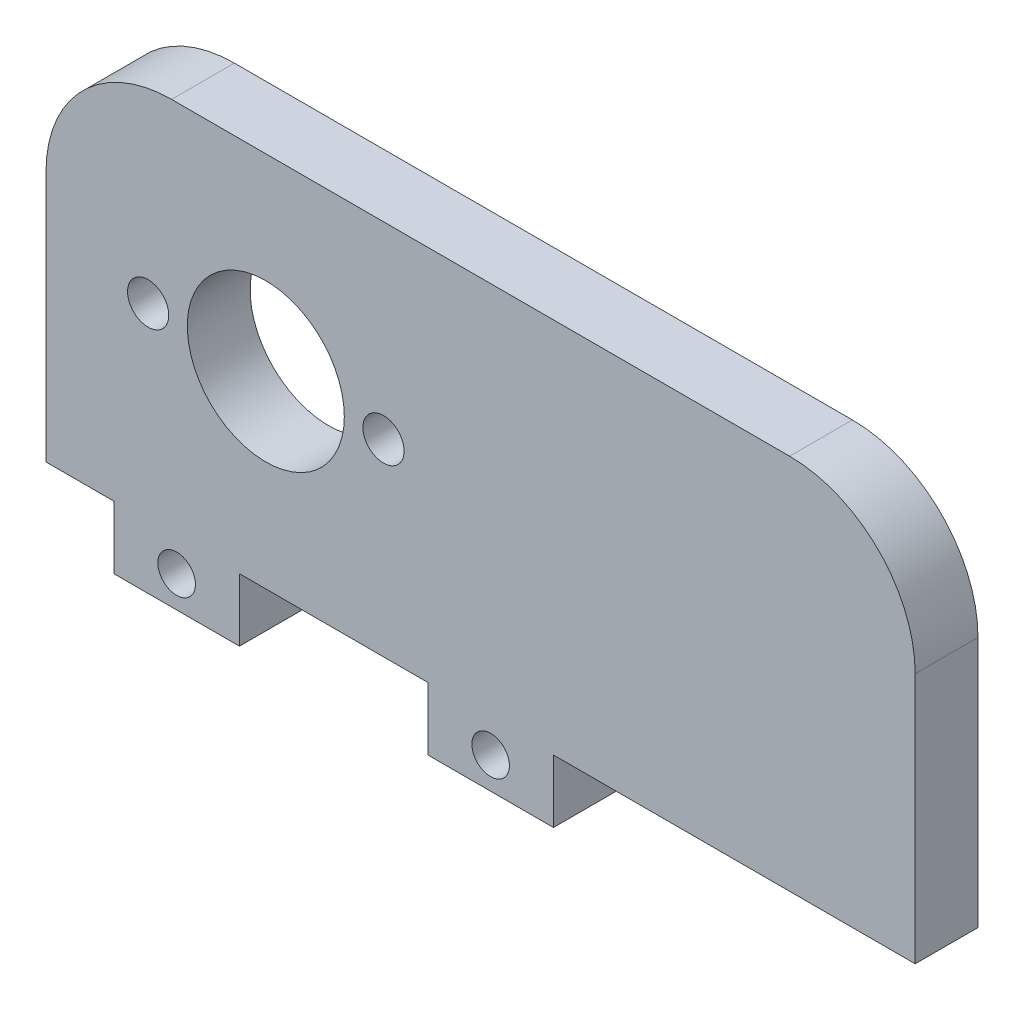
ISO-10303-21;
HEADER;
FILE_DESCRIPTION(('STEP AP214'),'2;1');
FILE_NAME('part.step','',(''),(''),'','','');
FILE_SCHEMA(('AUTOMOTIVE_DESIGN { 1 0 10303 214 1 1 1 1 }'));
ENDSEC;
DATA;
#1=APPLICATION_CONTEXT('core data for automotive mechanical design processes');
#2=APPLICATION_PROTOCOL_DEFINITION('international standard','automotive_design',2000,#1);
#3=PRODUCT_CONTEXT('',#1,'mechanical');
#4=PRODUCT('Part','Part','',(#3));
#5=PRODUCT_RELATED_PRODUCT_CATEGORY('part','',(#4));
#6=PRODUCT_DEFINITION_FORMATION('','',#4);
#7=PRODUCT_DEFINITION_CONTEXT('part definition',#1,'design');
#8=PRODUCT_DEFINITION('design','',#6,#7);
#9=PRODUCT_DEFINITION_SHAPE('','',#8);
#10=(LENGTH_UNIT() NAMED_UNIT(*) SI_UNIT(.MILLI.,.METRE.));
#11=(NAMED_UNIT(*) PLANE_ANGLE_UNIT() SI_UNIT($,.RADIAN.));
#12=(NAMED_UNIT(*) SI_UNIT($,.STERADIAN.) SOLID_ANGLE_UNIT());
#13=UNCERTAINTY_MEASURE_WITH_UNIT(LENGTH_MEASURE(1.E-05),#10,'distance_accuracy_value','');
#14=(GEOMETRIC_REPRESENTATION_CONTEXT(3) GLOBAL_UNCERTAINTY_ASSIGNED_CONTEXT((#13)) GLOBAL_UNIT_ASSIGNED_CONTEXT((#10,
#11,#12)) REPRESENTATION_CONTEXT('',''));
#15=CARTESIAN_POINT('',(0.,0.,0.));
#16=DIRECTION('',(0.,0.,1.));
#17=DIRECTION('',(1.,0.,0.));
#18=AXIS2_PLACEMENT_3D('',#15,#16,#17);
#19=CARTESIAN_POINT('',(-43.942,-22.225,3.175));
#20=DIRECTION('',(0.,1.,0.));
#21=DIRECTION('',(0.,0.,1.));
#22=AXIS2_PLACEMENT_3D('',#19,#20,#21);
#23=PLANE('',#22);
#24=DIRECTION('',(1.,0.,0.));
#25=VECTOR('',#24,1.);
#26=CARTESIAN_POINT('',(-43.942,-22.225,-3.175));
#27=LINE('',#26,#25);
#28=CARTESIAN_POINT('',(-37.084,-22.225,-3.175));
#29=VERTEX_POINT('',#28);
#30=CARTESIAN_POINT('',(-24.384,-22.225,-3.175));
#31=VERTEX_POINT('',#30);
#32=EDGE_CURVE('E164',#29,#31,#27,.T.);
#33=ORIENTED_EDGE('',*,*,#32,.T.);
#34=DIRECTION('',(0.,0.,1.));
#35=VECTOR('',#34,1.);
#36=CARTESIAN_POINT('',(-24.384,-22.225,-3.176));
#37=LINE('',#36,#35);
#38=CARTESIAN_POINT('',(-24.384,-22.225,3.175));
#39=VERTEX_POINT('',#38);
#40=EDGE_CURVE('E245',#31,#39,#37,.T.);
#41=ORIENTED_EDGE('',*,*,#40,.T.);
#42=DIRECTION('',(1.,0.,0.));
#43=VECTOR('',#42,1.);
#44=CARTESIAN_POINT('',(-43.942,-22.225,3.175));
#45=LINE('',#44,#43);
#46=CARTESIAN_POINT('',(-37.084,-22.225,3.175));
#47=VERTEX_POINT('',#46);
#48=EDGE_CURVE('E176',#47,#39,#45,.T.);
#49=ORIENTED_EDGE('',*,*,#48,.F.);
#50=DIRECTION('',(0.,0.,1.));
#51=VECTOR('',#50,1.);
#52=CARTESIAN_POINT('',(-37.084,-22.225,-3.176));
#53=LINE('',#52,#51);
#54=EDGE_CURVE('E228',#29,#47,#53,.T.);
#55=ORIENTED_EDGE('',*,*,#54,.F.);
#56=EDGE_LOOP('',(#33,#41,#49,#55));
#57=FACE_BOUND('',#56,.T.);
#58=ADVANCED_FACE('F34',(#57),#23,.F.);
#59=CARTESIAN_POINT('',(43.942,22.225,3.175));
#60=DIRECTION('',(-1.,0.,0.));
#61=DIRECTION('',(0.,-1.,0.));
#62=AXIS2_PLACEMENT_3D('',#59,#60,#61);
#63=PLANE('',#62);
#64=DIRECTION('',(0.,1.,0.));
#65=VECTOR('',#64,1.);
#66=CARTESIAN_POINT('',(43.942,22.225,-3.175));
#67=LINE('',#66,#65);
#68=CARTESIAN_POINT('',(43.942,-15.875,-3.175));
#69=VERTEX_POINT('',#68);
#70=CARTESIAN_POINT('',(43.942,9.525,-3.175));
#71=VERTEX_POINT('',#70);
#72=EDGE_CURVE('E199',#69,#71,#67,.T.);
#73=ORIENTED_EDGE('',*,*,#72,.T.);
#74=DIRECTION('',(0.,0.,-1.));
#75=VECTOR('',#74,1.);
#76=CARTESIAN_POINT('',(43.942,9.525,3.175));
#77=LINE('',#76,#75);
#78=CARTESIAN_POINT('',(43.942,9.525,3.175));
#79=VERTEX_POINT('',#78);
#80=EDGE_CURVE('E57',#71,#79,#77,.F.);
#81=ORIENTED_EDGE('',*,*,#80,.T.);
#82=DIRECTION('',(0.,1.,0.));
#83=VECTOR('',#82,1.);
#84=CARTESIAN_POINT('',(43.942,22.225,3.175));
#85=LINE('',#84,#83);
#86=CARTESIAN_POINT('',(43.942,-15.875,3.175));
#87=VERTEX_POINT('',#86);
#88=EDGE_CURVE('E168',#87,#79,#85,.T.);
#89=ORIENTED_EDGE('',*,*,#88,.F.);
#90=DIRECTION('',(0.,0.,1.));
#91=VECTOR('',#90,1.);
#92=CARTESIAN_POINT('',(43.942,-15.875,-3.176));
#93=LINE('',#92,#91);
#94=EDGE_CURVE('E148',#69,#87,#93,.T.);
#95=ORIENTED_EDGE('',*,*,#94,.F.);
#96=EDGE_LOOP('',(#73,#81,#89,#95));
#97=FACE_BOUND('',#96,.T.);
#98=ADVANCED_FACE('F201',(#97),#63,.F.);
#99=CARTESIAN_POINT('',(-43.942,22.225,3.175));
#100=DIRECTION('',(0.,-1.,0.));
#101=DIRECTION('',(0.,0.,-1.));
#102=AXIS2_PLACEMENT_3D('',#99,#100,#101);
#103=PLANE('',#102);
#104=DIRECTION('',(-1.,0.,0.));
#105=VECTOR('',#104,1.);
#106=CARTESIAN_POINT('',(-43.942,22.225,3.175));
#107=LINE('',#106,#105);
#108=CARTESIAN_POINT('',(31.242,22.225,3.175));
#109=VERTEX_POINT('',#108);
#110=CARTESIAN_POINT('',(-31.242,22.225,3.175));
#111=VERTEX_POINT('',#110);
#112=EDGE_CURVE('E188',#109,#111,#107,.T.);
#113=ORIENTED_EDGE('',*,*,#112,.F.);
#114=DIRECTION('',(0.,0.,-1.));
#115=VECTOR('',#114,1.);
#116=CARTESIAN_POINT('',(31.242,22.225,3.175));
#117=LINE('',#116,#115);
#118=CARTESIAN_POINT('',(31.242,22.225,-3.175));
#119=VERTEX_POINT('',#118);
#120=EDGE_CURVE('E175',#109,#119,#117,.T.);
#121=ORIENTED_EDGE('',*,*,#120,.T.);
#122=DIRECTION('',(-1.,0.,0.));
#123=VECTOR('',#122,1.);
#124=CARTESIAN_POINT('',(-43.942,22.225,-3.175));
#125=LINE('',#124,#123);
#126=CARTESIAN_POINT('',(-31.242,22.225,-3.175));
#127=VERTEX_POINT('',#126);
#128=EDGE_CURVE('E169',#119,#127,#125,.T.);
#129=ORIENTED_EDGE('',*,*,#128,.T.);
#130=DIRECTION('',(0.,0.,-1.));
#131=VECTOR('',#130,1.);
#132=CARTESIAN_POINT('',(-31.242,22.225,3.175));
#133=LINE('',#132,#131);
#134=EDGE_CURVE('E173',#127,#111,#133,.F.);
#135=ORIENTED_EDGE('',*,*,#134,.T.);
#136=EDGE_LOOP('',(#113,#121,#129,#135));
#137=FACE_BOUND('',#136,.T.);
#138=ADVANCED_FACE('F193',(#137),#103,.F.);
#139=CARTESIAN_POINT('',(-43.942,22.225,3.175));
#140=DIRECTION('',(1.,0.,0.));
#141=DIRECTION('',(0.,1.,0.));
#142=AXIS2_PLACEMENT_3D('',#139,#140,#141);
#143=PLANE('',#142);
#144=DIRECTION('',(0.,-1.,0.));
#145=VECTOR('',#144,1.);
#146=CARTESIAN_POINT('',(-43.942,22.225,3.175));
#147=LINE('',#146,#145);
#148=CARTESIAN_POINT('',(-43.942,9.525,3.175));
#149=VERTEX_POINT('',#148);
#150=CARTESIAN_POINT('',(-43.942,-15.875,3.175));
#151=VERTEX_POINT('',#150);
#152=EDGE_CURVE('E196',#149,#151,#147,.T.);
#153=ORIENTED_EDGE('',*,*,#152,.F.);
#154=DIRECTION('',(0.,0.,-1.));
#155=VECTOR('',#154,1.);
#156=CARTESIAN_POINT('',(-43.942,9.525,3.175));
#157=LINE('',#156,#155);
#158=CARTESIAN_POINT('',(-43.942,9.525,-3.175));
#159=VERTEX_POINT('',#158);
#160=EDGE_CURVE('E11',#149,#159,#157,.T.);
#161=ORIENTED_EDGE('',*,*,#160,.T.);
#162=DIRECTION('',(0.,-1.,0.));
#163=VECTOR('',#162,1.);
#164=CARTESIAN_POINT('',(-43.942,22.225,-3.175));
#165=LINE('',#164,#163);
#166=CARTESIAN_POINT('',(-43.942,-15.875,-3.175));
#167=VERTEX_POINT('',#166);
#168=EDGE_CURVE('E165',#159,#167,#165,.T.);
#169=ORIENTED_EDGE('',*,*,#168,.T.);
#170=DIRECTION('',(0.,0.,1.));
#171=VECTOR('',#170,1.);
#172=CARTESIAN_POINT('',(-43.942,-15.875,-3.176));
#173=LINE('',#172,#171);
#174=EDGE_CURVE('E227',#167,#151,#173,.T.);
#175=ORIENTED_EDGE('',*,*,#174,.T.);
#176=EDGE_LOOP('',(#153,#161,#169,#175));
#177=FACE_BOUND('',#176,.T.);
#178=ADVANCED_FACE('F318',(#177),#143,.F.);
#179=CARTESIAN_POINT('',(-5.334,-22.225,-3.175));
#180=VERTEX_POINT('',#179);
#181=CARTESIAN_POINT('',(7.36599999999999,-22.225,-3.175));
#182=VERTEX_POINT('',#181);
#183=EDGE_CURVE('E157',#180,#182,#27,.T.);
#184=ORIENTED_EDGE('',*,*,#183,.T.);
#185=DIRECTION('',(0.,0.,1.));
#186=VECTOR('',#185,1.);
#187=CARTESIAN_POINT('',(7.366,-22.225,-3.176));
#188=LINE('',#187,#186);
#189=CARTESIAN_POINT('',(7.366,-22.225,3.175));
#190=VERTEX_POINT('',#189);
#191=EDGE_CURVE('E137',#182,#190,#188,.T.);
#192=ORIENTED_EDGE('',*,*,#191,.T.);
#193=CARTESIAN_POINT('',(-5.334,-22.225,3.175));
#194=VERTEX_POINT('',#193);
#195=EDGE_CURVE('E210',#194,#190,#45,.T.);
#196=ORIENTED_EDGE('',*,*,#195,.F.);
#197=DIRECTION('',(0.,0.,1.));
#198=VECTOR('',#197,1.);
#199=CARTESIAN_POINT('',(-5.334,-22.225,-3.176));
#200=LINE('',#199,#198);
#201=EDGE_CURVE('E163',#180,#194,#200,.T.);
#202=ORIENTED_EDGE('',*,*,#201,.F.);
#203=EDGE_LOOP('',(#184,#192,#196,#202));
#204=FACE_BOUND('',#203,.T.);
#205=ADVANCED_FACE('F162',(#204),#23,.F.);
#206=CARTESIAN_POINT('',(0.,0.,3.175));
#207=DIRECTION('',(0.,0.,1.));
#208=DIRECTION('',(1.,0.,0.));
#209=AXIS2_PLACEMENT_3D('',#206,#207,#208);
#210=PLANE('',#209);
#211=CARTESIAN_POINT('',(-30.734,-19.05,3.175));
#212=DIRECTION('',(0.,0.,1.));
#213=DIRECTION('',(1.,0.,0.));
#214=AXIS2_PLACEMENT_3D('',#211,#212,#213);
#215=CIRCLE('',#214,1.89864999999999);
#216=CARTESIAN_POINT('',(-28.83535,-19.05,3.175));
#217=VERTEX_POINT('',#216);
#218=EDGE_CURVE('E283',#217,#217,#215,.T.);
#219=ORIENTED_EDGE('',*,*,#218,.F.);
#220=EDGE_LOOP('',(#219));
#221=FACE_BOUND('',#220,.T.);
#222=CARTESIAN_POINT('',(1.016,-19.05,3.175));
#223=DIRECTION('',(0.,0.,1.));
#224=DIRECTION('',(1.,0.,0.));
#225=AXIS2_PLACEMENT_3D('',#222,#223,#224);
#226=CIRCLE('',#225,1.89864999999999);
#227=CARTESIAN_POINT('',(2.91464999999999,-19.05,3.175));
#228=VERTEX_POINT('',#227);
#229=EDGE_CURVE('E277',#228,#228,#226,.T.);
#230=ORIENTED_EDGE('',*,*,#229,.F.);
#231=EDGE_LOOP('',(#230));
#232=FACE_BOUND('',#231,.T.);
#233=ORIENTED_EDGE('',*,*,#88,.T.);
#234=CARTESIAN_POINT('',(31.242,9.525,3.175));
#235=DIRECTION('',(0.,0.,1.));
#236=DIRECTION('',(1.,0.,0.));
#237=AXIS2_PLACEMENT_3D('',#234,#235,#236);
#238=CIRCLE('',#237,12.7);
#239=EDGE_CURVE('E42',#79,#109,#238,.T.);
#240=ORIENTED_EDGE('',*,*,#239,.T.);
#241=ORIENTED_EDGE('',*,*,#112,.T.);
#242=CARTESIAN_POINT('',(-31.242,9.525,3.175));
#243=DIRECTION('',(0.,0.,1.));
#244=DIRECTION('',(1.,0.,0.));
#245=AXIS2_PLACEMENT_3D('',#242,#243,#244);
#246=CIRCLE('',#245,12.7);
#247=EDGE_CURVE('E49',#111,#149,#246,.T.);
#248=ORIENTED_EDGE('',*,*,#247,.T.);
#249=ORIENTED_EDGE('',*,*,#152,.T.);
#250=DIRECTION('',(-1.,0.,0.));
#251=VECTOR('',#250,1.);
#252=CARTESIAN_POINT('',(-43.942,-15.875,3.175));
#253=LINE('',#252,#251);
#254=CARTESIAN_POINT('',(-37.084,-15.875,3.175));
#255=VERTEX_POINT('',#254);
#256=EDGE_CURVE('E231',#255,#151,#253,.T.);
#257=ORIENTED_EDGE('',*,*,#256,.F.);
#258=DIRECTION('',(0.,1.,0.));
#259=VECTOR('',#258,1.);
#260=CARTESIAN_POINT('',(-37.084,-15.875,3.175));
#261=LINE('',#260,#259);
#262=EDGE_CURVE('E237',#47,#255,#261,.T.);
#263=ORIENTED_EDGE('',*,*,#262,.F.);
#264=ORIENTED_EDGE('',*,*,#48,.T.);
#265=DIRECTION('',(0.,-1.,0.));
#266=VECTOR('',#265,1.);
#267=CARTESIAN_POINT('',(-24.384,-15.875,3.175));
#268=LINE('',#267,#266);
#269=CARTESIAN_POINT('',(-24.384,-15.875,3.175));
#270=VERTEX_POINT('',#269);
#271=EDGE_CURVE('E258',#270,#39,#268,.T.);
#272=ORIENTED_EDGE('',*,*,#271,.F.);
#273=DIRECTION('',(-1.,0.,0.));
#274=VECTOR('',#273,1.);
#275=CARTESIAN_POINT('',(-24.384,-15.875,3.175));
#276=LINE('',#275,#274);
#277=CARTESIAN_POINT('',(-5.334,-15.875,3.175));
#278=VERTEX_POINT('',#277);
#279=EDGE_CURVE('E248',#278,#270,#276,.T.);
#280=ORIENTED_EDGE('',*,*,#279,.F.);
#281=DIRECTION('',(0.,1.,0.));
#282=VECTOR('',#281,1.);
#283=CARTESIAN_POINT('',(-5.334,-15.875,3.175));
#284=LINE('',#283,#282);
#285=EDGE_CURVE('E255',#194,#278,#284,.T.);
#286=ORIENTED_EDGE('',*,*,#285,.F.);
#287=ORIENTED_EDGE('',*,*,#195,.T.);
#288=DIRECTION('',(0.,-1.,0.));
#289=VECTOR('',#288,1.);
#290=CARTESIAN_POINT('',(7.366,-15.875,3.175));
#291=LINE('',#290,#289);
#292=CARTESIAN_POINT('',(7.366,-15.875,3.175));
#293=VERTEX_POINT('',#292);
#294=EDGE_CURVE('E143',#293,#190,#291,.T.);
#295=ORIENTED_EDGE('',*,*,#294,.F.);
#296=DIRECTION('',(-1.,0.,0.));
#297=VECTOR('',#296,1.);
#298=CARTESIAN_POINT('',(7.366,-15.875,3.175));
#299=LINE('',#298,#297);
#300=EDGE_CURVE('E149',#87,#293,#299,.T.);
#301=ORIENTED_EDGE('',*,*,#300,.F.);
#302=EDGE_LOOP('',(#233,#240,#241,#248,#249,#257,#263,#264,#272,#280,#286,#287,#295,#301));
#303=FACE_BOUND('',#302,.T.);
#304=CARTESIAN_POINT('',(-9.81710000000002,3.17500000000001,3.175));
#305=DIRECTION('',(0.,0.,1.));
#306=DIRECTION('',(1.,0.,0.));
#307=AXIS2_PLACEMENT_3D('',#304,#305,#306);
#308=CIRCLE('',#307,2.0828);
#309=CARTESIAN_POINT('',(-7.73430000000002,3.17500000000001,3.175));
#310=VERTEX_POINT('',#309);
#311=EDGE_CURVE('E224',#310,#310,#308,.T.);
#312=ORIENTED_EDGE('',*,*,#311,.F.);
#313=EDGE_LOOP('',(#312));
#314=FACE_BOUND('',#313,.T.);
#315=CARTESIAN_POINT('',(-33.6169,3.175,3.175));
#316=DIRECTION('',(0.,0.,1.));
#317=DIRECTION('',(1.,0.,0.));
#318=AXIS2_PLACEMENT_3D('',#315,#316,#317);
#319=CIRCLE('',#318,2.0828);
#320=CARTESIAN_POINT('',(-31.5341,3.175,3.175));
#321=VERTEX_POINT('',#320);
#322=EDGE_CURVE('E218',#321,#321,#319,.T.);
#323=ORIENTED_EDGE('',*,*,#322,.F.);
#324=EDGE_LOOP('',(#323));
#325=FACE_BOUND('',#324,.T.);
#326=CARTESIAN_POINT('',(-21.717,3.175,3.175));
#327=DIRECTION('',(0.,0.,1.));
#328=DIRECTION('',(1.,0.,0.));
#329=AXIS2_PLACEMENT_3D('',#326,#327,#328);
#330=CIRCLE('',#329,7.9375);
#331=CARTESIAN_POINT('',(-13.7795,3.175,3.175));
#332=VERTEX_POINT('',#331);
#333=EDGE_CURVE('E205',#332,#332,#330,.T.);
#334=ORIENTED_EDGE('',*,*,#333,.F.);
#335=EDGE_LOOP('',(#334));
#336=FACE_BOUND('',#335,.T.);
#337=ADVANCED_FACE('F186',(#221,#232,#303,#314,#325,#336),#210,.T.);
#338=CARTESIAN_POINT('',(0.,0.,-3.175));
#339=DIRECTION('',(0.,0.,1.));
#340=DIRECTION('',(1.,0.,0.));
#341=AXIS2_PLACEMENT_3D('',#338,#339,#340);
#342=PLANE('',#341);
#343=CARTESIAN_POINT('',(-30.734,-19.05,-3.17499999999999));
#344=DIRECTION('',(0.,0.,1.));
#345=DIRECTION('',(1.,0.,0.));
#346=AXIS2_PLACEMENT_3D('',#343,#344,#345);
#347=CIRCLE('',#346,1.89864999999999);
#348=CARTESIAN_POINT('',(-28.83535,-19.05,-3.17499999999999));
#349=VERTEX_POINT('',#348);
#350=EDGE_CURVE('E280',#349,#349,#347,.T.);
#351=ORIENTED_EDGE('',*,*,#350,.T.);
#352=EDGE_LOOP('',(#351));
#353=FACE_BOUND('',#352,.T.);
#354=CARTESIAN_POINT('',(1.016,-19.05,-3.17499999999999));
#355=DIRECTION('',(0.,0.,1.));
#356=DIRECTION('',(1.,0.,0.));
#357=AXIS2_PLACEMENT_3D('',#354,#355,#356);
#358=CIRCLE('',#357,1.89864999999999);
#359=CARTESIAN_POINT('',(2.91464999999999,-19.05,-3.17499999999999));
#360=VERTEX_POINT('',#359);
#361=EDGE_CURVE('E274',#360,#360,#358,.T.);
#362=ORIENTED_EDGE('',*,*,#361,.T.);
#363=EDGE_LOOP('',(#362));
#364=FACE_BOUND('',#363,.T.);
#365=CARTESIAN_POINT('',(-9.81710000000002,3.17500000000001,-3.175));
#366=DIRECTION('',(0.,0.,1.));
#367=DIRECTION('',(1.,0.,0.));
#368=AXIS2_PLACEMENT_3D('',#365,#366,#367);
#369=CIRCLE('',#368,2.0828);
#370=CARTESIAN_POINT('',(-7.73430000000002,3.17500000000001,-3.175));
#371=VERTEX_POINT('',#370);
#372=EDGE_CURVE('E221',#371,#371,#369,.T.);
#373=ORIENTED_EDGE('',*,*,#372,.T.);
#374=EDGE_LOOP('',(#373));
#375=FACE_BOUND('',#374,.T.);
#376=CARTESIAN_POINT('',(-33.6169,3.175,-3.175));
#377=DIRECTION('',(0.,0.,1.));
#378=DIRECTION('',(1.,0.,0.));
#379=AXIS2_PLACEMENT_3D('',#376,#377,#378);
#380=CIRCLE('',#379,2.0828);
#381=CARTESIAN_POINT('',(-31.5341,3.175,-3.175));
#382=VERTEX_POINT('',#381);
#383=EDGE_CURVE('E215',#382,#382,#380,.T.);
#384=ORIENTED_EDGE('',*,*,#383,.T.);
#385=EDGE_LOOP('',(#384));
#386=FACE_BOUND('',#385,.T.);
#387=CARTESIAN_POINT('',(-21.717,3.175,-3.175));
#388=DIRECTION('',(0.,0.,1.));
#389=DIRECTION('',(1.,0.,0.));
#390=AXIS2_PLACEMENT_3D('',#387,#388,#389);
#391=CIRCLE('',#390,7.9375);
#392=CARTESIAN_POINT('',(-13.7795,3.175,-3.175));
#393=VERTEX_POINT('',#392);
#394=EDGE_CURVE('E202',#393,#393,#391,.F.);
#395=ORIENTED_EDGE('',*,*,#394,.F.);
#396=EDGE_LOOP('',(#395));
#397=FACE_BOUND('',#396,.T.);
#398=ORIENTED_EDGE('',*,*,#128,.F.);
#399=CARTESIAN_POINT('',(31.242,9.525,-3.175));
#400=DIRECTION('',(0.,0.,1.));
#401=DIRECTION('',(1.,0.,0.));
#402=AXIS2_PLACEMENT_3D('',#399,#400,#401);
#403=CIRCLE('',#402,12.7);
#404=EDGE_CURVE('E181',#119,#71,#403,.F.);
#405=ORIENTED_EDGE('',*,*,#404,.T.);
#406=ORIENTED_EDGE('',*,*,#72,.F.);
#407=DIRECTION('',(1.,0.,0.));
#408=VECTOR('',#407,1.);
#409=CARTESIAN_POINT('',(7.366,-15.875,-3.175));
#410=LINE('',#409,#408);
#411=CARTESIAN_POINT('',(7.366,-15.875,-3.175));
#412=VERTEX_POINT('',#411);
#413=EDGE_CURVE('E159',#412,#69,#410,.T.);
#414=ORIENTED_EDGE('',*,*,#413,.F.);
#415=DIRECTION('',(0.,1.,0.));
#416=VECTOR('',#415,1.);
#417=CARTESIAN_POINT('',(7.366,-15.875,-3.175));
#418=LINE('',#417,#416);
#419=EDGE_CURVE('E140',#182,#412,#418,.T.);
#420=ORIENTED_EDGE('',*,*,#419,.F.);
#421=ORIENTED_EDGE('',*,*,#183,.F.);
#422=DIRECTION('',(0.,-1.,0.));
#423=VECTOR('',#422,1.);
#424=CARTESIAN_POINT('',(-5.334,-15.875,-3.175));
#425=LINE('',#424,#423);
#426=CARTESIAN_POINT('',(-5.334,-15.875,-3.175));
#427=VERTEX_POINT('',#426);
#428=EDGE_CURVE('E265',#427,#180,#425,.T.);
#429=ORIENTED_EDGE('',*,*,#428,.F.);
#430=DIRECTION('',(1.,0.,0.));
#431=VECTOR('',#430,1.);
#432=CARTESIAN_POINT('',(-24.384,-15.875,-3.175));
#433=LINE('',#432,#431);
#434=CARTESIAN_POINT('',(-24.384,-15.875,-3.175));
#435=VERTEX_POINT('',#434);
#436=EDGE_CURVE('E263',#435,#427,#433,.T.);
#437=ORIENTED_EDGE('',*,*,#436,.F.);
#438=DIRECTION('',(0.,1.,0.));
#439=VECTOR('',#438,1.);
#440=CARTESIAN_POINT('',(-24.384,-15.875,-3.175));
#441=LINE('',#440,#439);
#442=EDGE_CURVE('E260',#31,#435,#441,.T.);
#443=ORIENTED_EDGE('',*,*,#442,.F.);
#444=ORIENTED_EDGE('',*,*,#32,.F.);
#445=DIRECTION('',(0.,-1.,0.));
#446=VECTOR('',#445,1.);
#447=CARTESIAN_POINT('',(-37.084,-15.875,-3.175));
#448=LINE('',#447,#446);
#449=CARTESIAN_POINT('',(-37.084,-15.875,-3.175));
#450=VERTEX_POINT('',#449);
#451=EDGE_CURVE('E242',#450,#29,#448,.T.);
#452=ORIENTED_EDGE('',*,*,#451,.F.);
#453=DIRECTION('',(1.,0.,0.));
#454=VECTOR('',#453,1.);
#455=CARTESIAN_POINT('',(-43.942,-15.875,-3.175));
#456=LINE('',#455,#454);
#457=EDGE_CURVE('E240',#167,#450,#456,.T.);
#458=ORIENTED_EDGE('',*,*,#457,.F.);
#459=ORIENTED_EDGE('',*,*,#168,.F.);
#460=CARTESIAN_POINT('',(-31.242,9.525,-3.175));
#461=DIRECTION('',(0.,0.,1.));
#462=DIRECTION('',(1.,0.,0.));
#463=AXIS2_PLACEMENT_3D('',#460,#461,#462);
#464=CIRCLE('',#463,12.7);
#465=EDGE_CURVE('E179',#159,#127,#464,.F.);
#466=ORIENTED_EDGE('',*,*,#465,.T.);
#467=EDGE_LOOP('',(#398,#405,#406,#414,#420,#421,#429,#437,#443,#444,#452,#458,#459,#466));
#468=FACE_BOUND('',#467,.T.);
#469=ADVANCED_FACE('F155',(#353,#364,#375,#386,#397,#468),#342,.F.);
#470=CARTESIAN_POINT('',(-21.717,3.175,-3.176));
#471=DIRECTION('',(0.,0.,1.));
#472=DIRECTION('',(1.,0.,0.));
#473=AXIS2_PLACEMENT_3D('',#470,#471,#472);
#474=CYLINDRICAL_SURFACE('',#473,7.9375);
#475=ORIENTED_EDGE('',*,*,#333,.T.);
#476=EDGE_LOOP('',(#475));
#477=FACE_BOUND('',#476,.T.);
#478=ORIENTED_EDGE('',*,*,#394,.T.);
#479=EDGE_LOOP('',(#478));
#480=FACE_BOUND('',#479,.T.);
#481=ADVANCED_FACE('F383',(#477,#480),#474,.F.);
#482=CARTESIAN_POINT('',(-33.6169,3.175,3.175));
#483=DIRECTION('',(0.,0.,1.));
#484=DIRECTION('',(1.,0.,0.));
#485=AXIS2_PLACEMENT_3D('',#482,#483,#484);
#486=CYLINDRICAL_SURFACE('',#485,2.0828);
#487=ORIENTED_EDGE('',*,*,#383,.F.);
#488=EDGE_LOOP('',(#487));
#489=FACE_BOUND('',#488,.T.);
#490=ORIENTED_EDGE('',*,*,#322,.T.);
#491=EDGE_LOOP('',(#490));
#492=FACE_BOUND('',#491,.T.);
#493=ADVANCED_FACE('F379',(#489,#492),#486,.F.);
#494=CARTESIAN_POINT('',(-9.81710000000002,3.17500000000001,3.175));
#495=DIRECTION('',(0.,0.,1.));
#496=DIRECTION('',(1.,0.,0.));
#497=AXIS2_PLACEMENT_3D('',#494,#495,#496);
#498=CYLINDRICAL_SURFACE('',#497,2.0828);
#499=ORIENTED_EDGE('',*,*,#372,.F.);
#500=EDGE_LOOP('',(#499));
#501=FACE_BOUND('',#500,.T.);
#502=ORIENTED_EDGE('',*,*,#311,.T.);
#503=EDGE_LOOP('',(#502));
#504=FACE_BOUND('',#503,.T.);
#505=ADVANCED_FACE('F374',(#501,#504),#498,.F.);
#506=CARTESIAN_POINT('',(-43.942,-15.875,-3.176));
#507=DIRECTION('',(0.,1.,0.));
#508=DIRECTION('',(0.,0.,1.));
#509=AXIS2_PLACEMENT_3D('',#506,#507,#508);
#510=PLANE('',#509);
#511=ORIENTED_EDGE('',*,*,#457,.T.);
#512=DIRECTION('',(0.,0.,1.));
#513=VECTOR('',#512,1.);
#514=CARTESIAN_POINT('',(-37.084,-15.875,-3.176));
#515=LINE('',#514,#513);
#516=EDGE_CURVE('E230',#450,#255,#515,.T.);
#517=ORIENTED_EDGE('',*,*,#516,.T.);
#518=ORIENTED_EDGE('',*,*,#256,.T.);
#519=ORIENTED_EDGE('',*,*,#174,.F.);
#520=EDGE_LOOP('',(#511,#517,#518,#519));
#521=FACE_BOUND('',#520,.T.);
#522=ADVANCED_FACE('F342',(#521),#510,.F.);
#523=CARTESIAN_POINT('',(-37.084,-15.875,-3.176));
#524=DIRECTION('',(1.,0.,0.));
#525=DIRECTION('',(0.,1.,0.));
#526=AXIS2_PLACEMENT_3D('',#523,#524,#525);
#527=PLANE('',#526);
#528=ORIENTED_EDGE('',*,*,#451,.T.);
#529=ORIENTED_EDGE('',*,*,#54,.T.);
#530=ORIENTED_EDGE('',*,*,#262,.T.);
#531=ORIENTED_EDGE('',*,*,#516,.F.);
#532=EDGE_LOOP('',(#528,#529,#530,#531));
#533=FACE_BOUND('',#532,.T.);
#534=ADVANCED_FACE('F344',(#533),#527,.F.);
#535=CARTESIAN_POINT('',(-24.384,-15.875,-3.176));
#536=DIRECTION('',(-1.,0.,0.));
#537=DIRECTION('',(0.,0.,1.));
#538=AXIS2_PLACEMENT_3D('',#535,#536,#537);
#539=PLANE('',#538);
#540=ORIENTED_EDGE('',*,*,#442,.T.);
#541=DIRECTION('',(0.,0.,1.));
#542=VECTOR('',#541,1.);
#543=CARTESIAN_POINT('',(-24.384,-15.875,-3.176));
#544=LINE('',#543,#542);
#545=EDGE_CURVE('E244',#435,#270,#544,.T.);
#546=ORIENTED_EDGE('',*,*,#545,.T.);
#547=ORIENTED_EDGE('',*,*,#271,.T.);
#548=ORIENTED_EDGE('',*,*,#40,.F.);
#549=EDGE_LOOP('',(#540,#546,#547,#548));
#550=FACE_BOUND('',#549,.T.);
#551=ADVANCED_FACE('F352',(#550),#539,.F.);
#552=CARTESIAN_POINT('',(-24.384,-15.875,-3.176));
#553=DIRECTION('',(0.,1.,0.));
#554=DIRECTION('',(0.,0.,1.));
#555=AXIS2_PLACEMENT_3D('',#552,#553,#554);
#556=PLANE('',#555);
#557=ORIENTED_EDGE('',*,*,#436,.T.);
#558=DIRECTION('',(0.,0.,1.));
#559=VECTOR('',#558,1.);
#560=CARTESIAN_POINT('',(-5.334,-15.875,-3.176));
#561=LINE('',#560,#559);
#562=EDGE_CURVE('E250',#427,#278,#561,.T.);
#563=ORIENTED_EDGE('',*,*,#562,.T.);
#564=ORIENTED_EDGE('',*,*,#279,.T.);
#565=ORIENTED_EDGE('',*,*,#545,.F.);
#566=EDGE_LOOP('',(#557,#563,#564,#565));
#567=FACE_BOUND('',#566,.T.);
#568=ADVANCED_FACE('F356',(#567),#556,.F.);
#569=CARTESIAN_POINT('',(-5.334,-15.875,-3.176));
#570=DIRECTION('',(1.,0.,0.));
#571=DIRECTION('',(0.,0.,-1.));
#572=AXIS2_PLACEMENT_3D('',#569,#570,#571);
#573=PLANE('',#572);
#574=ORIENTED_EDGE('',*,*,#428,.T.);
#575=ORIENTED_EDGE('',*,*,#201,.T.);
#576=ORIENTED_EDGE('',*,*,#285,.T.);
#577=ORIENTED_EDGE('',*,*,#562,.F.);
#578=EDGE_LOOP('',(#574,#575,#576,#577));
#579=FACE_BOUND('',#578,.T.);
#580=ADVANCED_FACE('F358',(#579),#573,.F.);
#581=CARTESIAN_POINT('',(7.366,-15.875,-3.176));
#582=DIRECTION('',(-1.,0.,0.));
#583=DIRECTION('',(0.,-1.,0.));
#584=AXIS2_PLACEMENT_3D('',#581,#582,#583);
#585=PLANE('',#584);
#586=ORIENTED_EDGE('',*,*,#419,.T.);
#587=DIRECTION('',(0.,0.,1.));
#588=VECTOR('',#587,1.);
#589=CARTESIAN_POINT('',(7.366,-15.875,-3.176));
#590=LINE('',#589,#588);
#591=EDGE_CURVE('E266',#412,#293,#590,.T.);
#592=ORIENTED_EDGE('',*,*,#591,.T.);
#593=ORIENTED_EDGE('',*,*,#294,.T.);
#594=ORIENTED_EDGE('',*,*,#191,.F.);
#595=EDGE_LOOP('',(#586,#592,#593,#594));
#596=FACE_BOUND('',#595,.T.);
#597=ADVANCED_FACE('F139',(#596),#585,.F.);
#598=CARTESIAN_POINT('',(7.366,-15.875,-3.176));
#599=DIRECTION('',(0.,1.,0.));
#600=DIRECTION('',(0.,0.,1.));
#601=AXIS2_PLACEMENT_3D('',#598,#599,#600);
#602=PLANE('',#601);
#603=ORIENTED_EDGE('',*,*,#413,.T.);
#604=ORIENTED_EDGE('',*,*,#94,.T.);
#605=ORIENTED_EDGE('',*,*,#300,.T.);
#606=ORIENTED_EDGE('',*,*,#591,.F.);
#607=EDGE_LOOP('',(#603,#604,#605,#606));
#608=FACE_BOUND('',#607,.T.);
#609=ADVANCED_FACE('F296',(#608),#602,.F.);
#610=CARTESIAN_POINT('',(1.016,-19.05,3.175));
#611=DIRECTION('',(0.,0.,1.));
#612=DIRECTION('',(1.,0.,0.));
#613=AXIS2_PLACEMENT_3D('',#610,#611,#612);
#614=CYLINDRICAL_SURFACE('',#613,1.89864999999999);
#615=ORIENTED_EDGE('',*,*,#361,.F.);
#616=EDGE_LOOP('',(#615));
#617=FACE_BOUND('',#616,.T.);
#618=ORIENTED_EDGE('',*,*,#229,.T.);
#619=EDGE_LOOP('',(#618));
#620=FACE_BOUND('',#619,.T.);
#621=ADVANCED_FACE('F294',(#617,#620),#614,.F.);
#622=CARTESIAN_POINT('',(-30.734,-19.05,3.175));
#623=DIRECTION('',(0.,0.,1.));
#624=DIRECTION('',(1.,0.,0.));
#625=AXIS2_PLACEMENT_3D('',#622,#623,#624);
#626=CYLINDRICAL_SURFACE('',#625,1.89864999999999);
#627=ORIENTED_EDGE('',*,*,#350,.F.);
#628=EDGE_LOOP('',(#627));
#629=FACE_BOUND('',#628,.T.);
#630=ORIENTED_EDGE('',*,*,#218,.T.);
#631=EDGE_LOOP('',(#630));
#632=FACE_BOUND('',#631,.T.);
#633=ADVANCED_FACE('F287',(#629,#632),#626,.F.);
#634=CARTESIAN_POINT('',(31.242,9.525,3.175));
#635=DIRECTION('',(0.,0.,-1.));
#636=DIRECTION('',(-1.,0.,0.));
#637=AXIS2_PLACEMENT_3D('',#634,#635,#636);
#638=CYLINDRICAL_SURFACE('',#637,12.7);
#639=ORIENTED_EDGE('',*,*,#239,.F.);
#640=ORIENTED_EDGE('',*,*,#80,.F.);
#641=ORIENTED_EDGE('',*,*,#404,.F.);
#642=ORIENTED_EDGE('',*,*,#120,.F.);
#643=EDGE_LOOP('',(#639,#640,#641,#642));
#644=FACE_BOUND('',#643,.T.);
#645=ADVANCED_FACE('F198',(#644),#638,.T.);
#646=CARTESIAN_POINT('',(-31.242,9.525,3.175));
#647=DIRECTION('',(0.,0.,-1.));
#648=DIRECTION('',(-1.,0.,0.));
#649=AXIS2_PLACEMENT_3D('',#646,#647,#648);
#650=CYLINDRICAL_SURFACE('',#649,12.7);
#651=ORIENTED_EDGE('',*,*,#247,.F.);
#652=ORIENTED_EDGE('',*,*,#134,.F.);
#653=ORIENTED_EDGE('',*,*,#465,.F.);
#654=ORIENTED_EDGE('',*,*,#160,.F.);
#655=EDGE_LOOP('',(#651,#652,#653,#654));
#656=FACE_BOUND('',#655,.T.);
#657=ADVANCED_FACE('F36',(#656),#650,.T.);
#658=CLOSED_SHELL('',(#58,#98,#138,#178,#205,#337,#469,#481,#493,#505,#522,#534,#551,#568,#580,
#597,#609,#621,#633,#645,#657));
#659=MANIFOLD_SOLID_BREP('B2',#658);
#660=ADVANCED_BREP_SHAPE_REPRESENTATION('',(#18,#659),#14);
#661=SHAPE_DEFINITION_REPRESENTATION(#9,#660);
ENDSEC;
END-ISO-10303-21;
